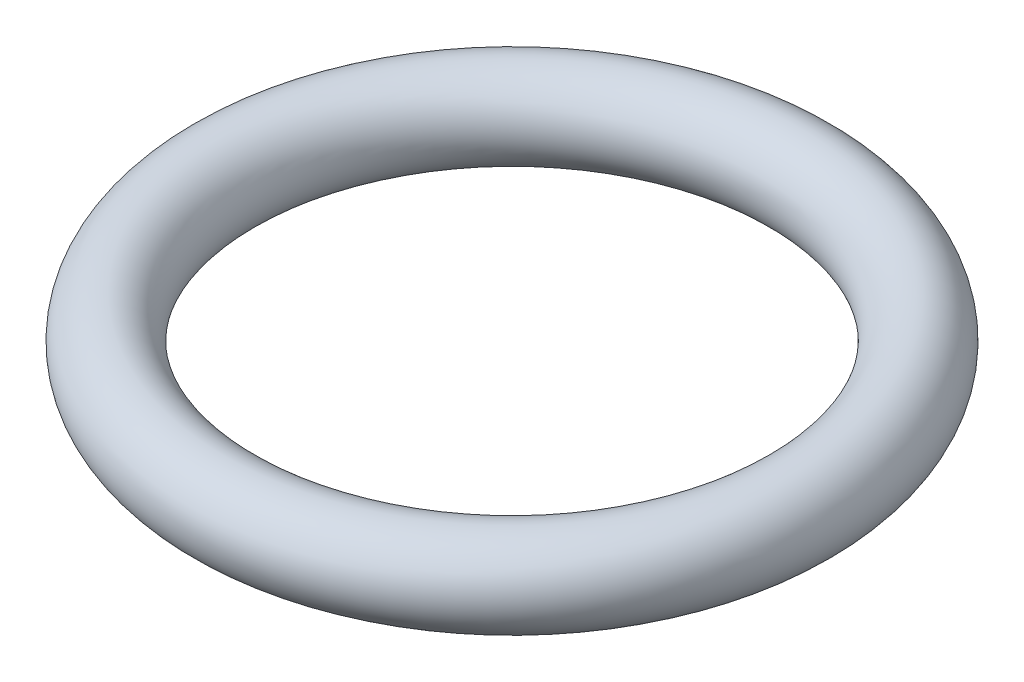
ISO-10303-21;
HEADER;
FILE_DESCRIPTION(('STEP AP214'),'2;1');
FILE_NAME('part.step','',(''),(''),'','','');
FILE_SCHEMA(('AUTOMOTIVE_DESIGN { 1 0 10303 214 1 1 1 1 }'));
ENDSEC;
DATA;
#1=APPLICATION_CONTEXT('core data for automotive mechanical design processes');
#2=APPLICATION_PROTOCOL_DEFINITION('international standard','automotive_design',2000,#1);
#3=PRODUCT_CONTEXT('',#1,'mechanical');
#4=PRODUCT('Part','Part','',(#3));
#5=PRODUCT_RELATED_PRODUCT_CATEGORY('part','',(#4));
#6=PRODUCT_DEFINITION_FORMATION('','',#4);
#7=PRODUCT_DEFINITION_CONTEXT('part definition',#1,'design');
#8=PRODUCT_DEFINITION('design','',#6,#7);
#9=PRODUCT_DEFINITION_SHAPE('','',#8);
#10=(LENGTH_UNIT() NAMED_UNIT(*) SI_UNIT(.MILLI.,.METRE.));
#11=(NAMED_UNIT(*) PLANE_ANGLE_UNIT() SI_UNIT($,.RADIAN.));
#12=(NAMED_UNIT(*) SI_UNIT($,.STERADIAN.) SOLID_ANGLE_UNIT());
#13=UNCERTAINTY_MEASURE_WITH_UNIT(LENGTH_MEASURE(1.E-05),#10,'distance_accuracy_value','');
#14=(GEOMETRIC_REPRESENTATION_CONTEXT(3) GLOBAL_UNCERTAINTY_ASSIGNED_CONTEXT((#13)) GLOBAL_UNIT_ASSIGNED_CONTEXT((#10,
#11,#12)) REPRESENTATION_CONTEXT('',''));
#15=CARTESIAN_POINT('',(0.,0.,0.));
#16=DIRECTION('',(0.,0.,1.));
#17=DIRECTION('',(1.,0.,0.));
#18=AXIS2_PLACEMENT_3D('',#15,#16,#17);
#19=CARTESIAN_POINT('',(0.,0.,0.));
#20=DIRECTION('',(0.,-1.,0.));
#21=DIRECTION('',(1.,0.,0.));
#22=AXIS2_PLACEMENT_3D('',#19,#20,#21);
#23=TOROIDAL_SURFACE('',#22,5.3848,0.79375);
#24=CARTESIAN_POINT('',(6.17855,0.,0.));
#25=VERTEX_POINT('',#24);
#26=VERTEX_LOOP('',#25);
#27=FACE_BOUND('',#26,.T.);
#28=ADVANCED_FACE('F29',(#27),#23,.T.);
#29=CLOSED_SHELL('',(#28));
#30=MANIFOLD_SOLID_BREP('B2',#29);
#31=ADVANCED_BREP_SHAPE_REPRESENTATION('',(#18,#30),#14);
#32=SHAPE_DEFINITION_REPRESENTATION(#9,#31);
ENDSEC;
END-ISO-10303-21;
